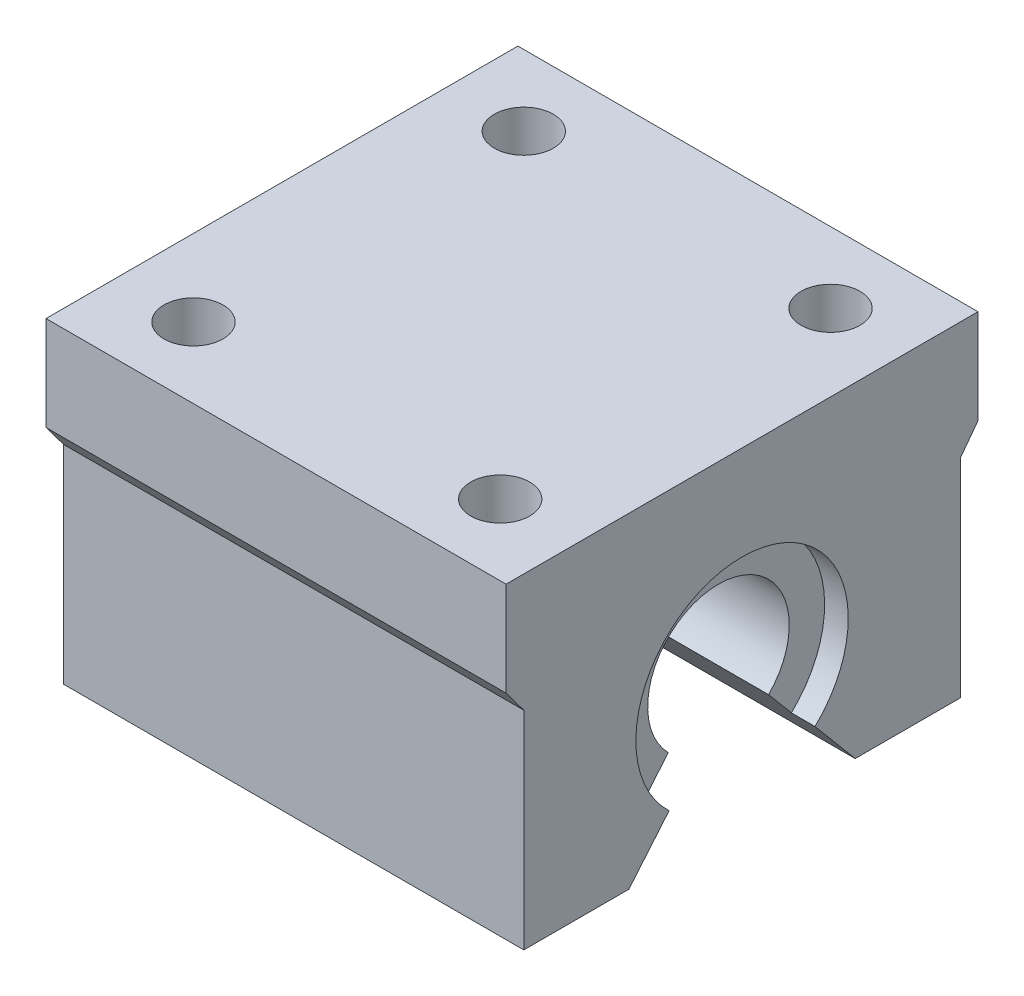
ISO-10303-21;
HEADER;
FILE_DESCRIPTION(('STEP AP214'),'2;1');
FILE_NAME('part.step','',(''),(''),'','','');
FILE_SCHEMA(('AUTOMOTIVE_DESIGN { 1 0 10303 214 1 1 1 1 }'));
ENDSEC;
DATA;
#1=APPLICATION_CONTEXT('core data for automotive mechanical design processes');
#2=APPLICATION_PROTOCOL_DEFINITION('international standard','automotive_design',2000,#1);
#3=PRODUCT_CONTEXT('',#1,'mechanical');
#4=PRODUCT('Part','Part','',(#3));
#5=PRODUCT_RELATED_PRODUCT_CATEGORY('part','',(#4));
#6=PRODUCT_DEFINITION_FORMATION('','',#4);
#7=PRODUCT_DEFINITION_CONTEXT('part definition',#1,'design');
#8=PRODUCT_DEFINITION('design','',#6,#7);
#9=PRODUCT_DEFINITION_SHAPE('','',#8);
#10=(LENGTH_UNIT() NAMED_UNIT(*) SI_UNIT(.MILLI.,.METRE.));
#11=(NAMED_UNIT(*) PLANE_ANGLE_UNIT() SI_UNIT($,.RADIAN.));
#12=(NAMED_UNIT(*) SI_UNIT($,.STERADIAN.) SOLID_ANGLE_UNIT());
#13=UNCERTAINTY_MEASURE_WITH_UNIT(LENGTH_MEASURE(1.E-05),#10,'distance_accuracy_value','');
#14=(GEOMETRIC_REPRESENTATION_CONTEXT(3) GLOBAL_UNCERTAINTY_ASSIGNED_CONTEXT((#13)) GLOBAL_UNIT_ASSIGNED_CONTEXT((#10,
#11,#12)) REPRESENTATION_CONTEXT('',''));
#15=CARTESIAN_POINT('',(0.,0.,0.));
#16=DIRECTION('',(0.,0.,1.));
#17=DIRECTION('',(1.,0.,0.));
#18=AXIS2_PLACEMENT_3D('',#15,#16,#17);
#19=CARTESIAN_POINT('',(39.,10.6,-20.));
#20=DIRECTION('',(-1.,0.,0.));
#21=DIRECTION('',(0.,0.,1.));
#22=AXIS2_PLACEMENT_3D('',#19,#20,#21);
#23=CYLINDRICAL_SURFACE('',#22,6.);
#24=CARTESIAN_POINT('',(37.,10.6,-20.));
#25=DIRECTION('',(1.,0.,0.));
#26=DIRECTION('',(0.,0.,-1.));
#27=AXIS2_PLACEMENT_3D('',#24,#25,#26);
#28=CIRCLE('',#27,6.);
#29=CARTESIAN_POINT('',(37.,6.36473141347565,-15.75));
#30=VERTEX_POINT('',#29);
#31=CARTESIAN_POINT('',(37.,6.36473141347565,-24.25));
#32=VERTEX_POINT('',#31);
#33=EDGE_CURVE('E253',#30,#32,#28,.F.);
#34=ORIENTED_EDGE('',*,*,#33,.F.);
#35=DIRECTION('',(-1.,0.,0.));
#36=VECTOR('',#35,1.);
#37=CARTESIAN_POINT('',(39.,6.36473141347565,-15.75));
#38=LINE('',#37,#36);
#39=CARTESIAN_POINT('',(2.,6.36473141347565,-15.75));
#40=VERTEX_POINT('',#39);
#41=EDGE_CURVE('E208',#30,#40,#38,.T.);
#42=ORIENTED_EDGE('',*,*,#41,.T.);
#43=CARTESIAN_POINT('',(2.,10.6,-20.));
#44=DIRECTION('',(-1.,0.,0.));
#45=DIRECTION('',(0.,0.,1.));
#46=AXIS2_PLACEMENT_3D('',#43,#44,#45);
#47=CIRCLE('',#46,6.);
#48=CARTESIAN_POINT('',(2.,6.36473141347565,-24.25));
#49=VERTEX_POINT('',#48);
#50=EDGE_CURVE('E239',#49,#40,#47,.F.);
#51=ORIENTED_EDGE('',*,*,#50,.F.);
#52=DIRECTION('',(-1.,0.,0.));
#53=VECTOR('',#52,1.);
#54=CARTESIAN_POINT('',(39.,6.36473141347565,-24.25));
#55=LINE('',#54,#53);
#56=EDGE_CURVE('E206',#32,#49,#55,.T.);
#57=ORIENTED_EDGE('',*,*,#56,.F.);
#58=EDGE_LOOP('',(#34,#42,#51,#57));
#59=FACE_BOUND('',#58,.T.);
#60=ADVANCED_FACE('F35',(#59),#23,.F.);
#61=CARTESIAN_POINT('',(39.,6.36473141347565,-15.75));
#62=DIRECTION('',(0.,0.642787609686541,0.766044443118976));
#63=DIRECTION('',(0.,-0.766044443118976,0.642787609686541));
#64=AXIS2_PLACEMENT_3D('',#61,#62,#63);
#65=PLANE('',#64);
#66=DIRECTION('',(1.,0.,0.));
#67=VECTOR('',#66,1.);
#68=CARTESIAN_POINT('',(37.,4.06052054100427,-13.8165375067546));
#69=LINE('',#68,#67);
#70=CARTESIAN_POINT('',(39.,4.06052054100427,-13.8165375067546));
#71=VERTEX_POINT('',#70);
#72=CARTESIAN_POINT('',(37.,4.06052054100427,-13.8165375067546));
#73=VERTEX_POINT('',#72);
#74=EDGE_CURVE('E255',#71,#73,#69,.F.);
#75=ORIENTED_EDGE('',*,*,#74,.F.);
#76=DIRECTION('',(0.,0.766044443118976,-0.642787609686541));
#77=VECTOR('',#76,1.);
#78=CARTESIAN_POINT('',(39.,6.36473141347565,-15.75));
#79=LINE('',#78,#77);
#80=CARTESIAN_POINT('',(39.,0.,-10.4093562184101));
#81=VERTEX_POINT('',#80);
#82=EDGE_CURVE('E223',#81,#71,#79,.T.);
#83=ORIENTED_EDGE('',*,*,#82,.F.);
#84=DIRECTION('',(-1.,0.,0.));
#85=VECTOR('',#84,1.);
#86=CARTESIAN_POINT('',(39.,0.,-10.4093562184101));
#87=LINE('',#86,#85);
#88=CARTESIAN_POINT('',(0.,0.,-10.4093562184101));
#89=VERTEX_POINT('',#88);
#90=EDGE_CURVE('E210',#81,#89,#87,.T.);
#91=ORIENTED_EDGE('',*,*,#90,.T.);
#92=DIRECTION('',(0.,0.766044443118976,-0.642787609686541));
#93=VECTOR('',#92,1.);
#94=CARTESIAN_POINT('',(0.,6.36473141347565,-15.75));
#95=LINE('',#94,#93);
#96=CARTESIAN_POINT('',(0.,4.06052054100427,-13.8165375067546));
#97=VERTEX_POINT('',#96);
#98=EDGE_CURVE('E187',#89,#97,#95,.T.);
#99=ORIENTED_EDGE('',*,*,#98,.T.);
#100=DIRECTION('',(-1.,0.,0.));
#101=VECTOR('',#100,1.);
#102=CARTESIAN_POINT('',(2.,4.06052054100427,-13.8165375067546));
#103=LINE('',#102,#101);
#104=CARTESIAN_POINT('',(2.,4.06052054100427,-13.8165375067546));
#105=VERTEX_POINT('',#104);
#106=EDGE_CURVE('E242',#97,#105,#103,.F.);
#107=ORIENTED_EDGE('',*,*,#106,.T.);
#108=DIRECTION('',(0.,-0.766044443118976,0.642787609686541));
#109=VECTOR('',#108,1.);
#110=CARTESIAN_POINT('',(2.,6.36473141347565,-15.75));
#111=LINE('',#110,#109);
#112=EDGE_CURVE('E185',#40,#105,#111,.T.);
#113=ORIENTED_EDGE('',*,*,#112,.F.);
#114=ORIENTED_EDGE('',*,*,#41,.F.);
#115=DIRECTION('',(0.,0.766044443118976,-0.642787609686541));
#116=VECTOR('',#115,1.);
#117=CARTESIAN_POINT('',(37.,6.36473141347565,-15.75));
#118=LINE('',#117,#116);
#119=EDGE_CURVE('E251',#73,#30,#118,.T.);
#120=ORIENTED_EDGE('',*,*,#119,.F.);
#121=EDGE_LOOP('',(#75,#83,#91,#99,#107,#113,#114,#120));
#122=FACE_BOUND('',#121,.T.);
#123=ADVANCED_FACE('F329',(#122),#65,.F.);
#124=CARTESIAN_POINT('',(39.,6.36473141347565,-24.25));
#125=DIRECTION('',(0.,0.642787609686541,-0.766044443118976));
#126=DIRECTION('',(0.,0.766044443118976,0.642787609686541));
#127=AXIS2_PLACEMENT_3D('',#124,#125,#126);
#128=PLANE('',#127);
#129=DIRECTION('',(1.,0.,0.));
#130=VECTOR('',#129,1.);
#131=CARTESIAN_POINT('',(37.,4.06052054100427,-26.1834624932454));
#132=LINE('',#131,#130);
#133=CARTESIAN_POINT('',(37.,4.06052054100427,-26.1834624932454));
#134=VERTEX_POINT('',#133);
#135=CARTESIAN_POINT('',(39.,4.06052054100427,-26.1834624932454));
#136=VERTEX_POINT('',#135);
#137=EDGE_CURVE('E230',#134,#136,#132,.T.);
#138=ORIENTED_EDGE('',*,*,#137,.F.);
#139=DIRECTION('',(0.,-0.766044443118976,-0.642787609686541));
#140=VECTOR('',#139,1.);
#141=CARTESIAN_POINT('',(37.,6.36473141347565,-24.25));
#142=LINE('',#141,#140);
#143=EDGE_CURVE('E11',#32,#134,#142,.T.);
#144=ORIENTED_EDGE('',*,*,#143,.F.);
#145=ORIENTED_EDGE('',*,*,#56,.T.);
#146=DIRECTION('',(0.,0.766044443118976,0.642787609686541));
#147=VECTOR('',#146,1.);
#148=CARTESIAN_POINT('',(2.,6.36473141347565,-24.25));
#149=LINE('',#148,#147);
#150=CARTESIAN_POINT('',(2.,4.06052054100427,-26.1834624932454));
#151=VERTEX_POINT('',#150);
#152=EDGE_CURVE('E216',#151,#49,#149,.T.);
#153=ORIENTED_EDGE('',*,*,#152,.F.);
#154=DIRECTION('',(-1.,0.,0.));
#155=VECTOR('',#154,1.);
#156=CARTESIAN_POINT('',(2.,4.06052054100427,-26.1834624932454));
#157=LINE('',#156,#155);
#158=CARTESIAN_POINT('',(0.,4.06052054100428,-26.1834624932454));
#159=VERTEX_POINT('',#158);
#160=EDGE_CURVE('E245',#151,#159,#157,.T.);
#161=ORIENTED_EDGE('',*,*,#160,.T.);
#162=DIRECTION('',(0.,-0.766044443118976,-0.642787609686541));
#163=VECTOR('',#162,1.);
#164=CARTESIAN_POINT('',(0.,6.36473141347565,-24.25));
#165=LINE('',#164,#163);
#166=CARTESIAN_POINT('',(0.,0.,-29.5906437815899));
#167=VERTEX_POINT('',#166);
#168=EDGE_CURVE('E190',#159,#167,#165,.T.);
#169=ORIENTED_EDGE('',*,*,#168,.T.);
#170=DIRECTION('',(-1.,0.,0.));
#171=VECTOR('',#170,1.);
#172=CARTESIAN_POINT('',(39.,0.,-29.5906437815899));
#173=LINE('',#172,#171);
#174=CARTESIAN_POINT('',(39.,0.,-29.5906437815899));
#175=VERTEX_POINT('',#174);
#176=EDGE_CURVE('E203',#175,#167,#173,.T.);
#177=ORIENTED_EDGE('',*,*,#176,.F.);
#178=DIRECTION('',(0.,-0.766044443118976,-0.642787609686541));
#179=VECTOR('',#178,1.);
#180=CARTESIAN_POINT('',(39.,6.36473141347565,-24.25));
#181=LINE('',#180,#179);
#182=EDGE_CURVE('E177',#136,#175,#181,.T.);
#183=ORIENTED_EDGE('',*,*,#182,.F.);
#184=EDGE_LOOP('',(#138,#144,#145,#153,#161,#169,#177,#183));
#185=FACE_BOUND('',#184,.T.);
#186=ADVANCED_FACE('F228',(#185),#128,.F.);
#187=CARTESIAN_POINT('',(39.,10.6,-20.));
#188=DIRECTION('',(1.,0.,0.));
#189=DIRECTION('',(0.,0.,-1.));
#190=AXIS2_PLACEMENT_3D('',#187,#188,#189);
#191=PLANE('',#190);
#192=DIRECTION('',(0.,0.8,-0.6));
#193=VECTOR('',#192,1.);
#194=CARTESIAN_POINT('',(39.,17.6,-38.5));
#195=LINE('',#194,#193);
#196=CARTESIAN_POINT('',(39.,17.6,-38.5));
#197=VERTEX_POINT('',#196);
#198=CARTESIAN_POINT('',(39.,19.6,-40.));
#199=VERTEX_POINT('',#198);
#200=EDGE_CURVE('E152',#197,#199,#195,.T.);
#201=ORIENTED_EDGE('',*,*,#200,.T.);
#202=DIRECTION('',(0.,1.,0.));
#203=VECTOR('',#202,1.);
#204=CARTESIAN_POINT('',(39.,0.,-40.));
#205=LINE('',#204,#203);
#206=CARTESIAN_POINT('',(39.,27.6,-40.));
#207=VERTEX_POINT('',#206);
#208=EDGE_CURVE('E163',#199,#207,#205,.T.);
#209=ORIENTED_EDGE('',*,*,#208,.T.);
#210=DIRECTION('',(0.,0.,1.));
#211=VECTOR('',#210,1.);
#212=CARTESIAN_POINT('',(39.,27.6,0.));
#213=LINE('',#212,#211);
#214=CARTESIAN_POINT('',(39.,27.6,0.));
#215=VERTEX_POINT('',#214);
#216=EDGE_CURVE('E172',#207,#215,#213,.T.);
#217=ORIENTED_EDGE('',*,*,#216,.T.);
#218=DIRECTION('',(0.,-1.,0.));
#219=VECTOR('',#218,1.);
#220=CARTESIAN_POINT('',(39.,0.,0.));
#221=LINE('',#220,#219);
#222=CARTESIAN_POINT('',(39.,19.6,0.));
#223=VERTEX_POINT('',#222);
#224=EDGE_CURVE('E199',#215,#223,#221,.T.);
#225=ORIENTED_EDGE('',*,*,#224,.T.);
#226=DIRECTION('',(0.,-0.8,-0.6));
#227=VECTOR('',#226,1.);
#228=CARTESIAN_POINT('',(39.,17.6,-1.5));
#229=LINE('',#228,#227);
#230=CARTESIAN_POINT('',(39.,17.6,-1.5));
#231=VERTEX_POINT('',#230);
#232=EDGE_CURVE('E294',#223,#231,#229,.T.);
#233=ORIENTED_EDGE('',*,*,#232,.T.);
#234=DIRECTION('',(0.,-1.,0.));
#235=VECTOR('',#234,1.);
#236=CARTESIAN_POINT('',(39.,0.,-1.5));
#237=LINE('',#236,#235);
#238=CARTESIAN_POINT('',(39.,0.,-1.5));
#239=VERTEX_POINT('',#238);
#240=EDGE_CURVE('E288',#231,#239,#237,.T.);
#241=ORIENTED_EDGE('',*,*,#240,.T.);
#242=DIRECTION('',(0.,0.,-1.));
#243=VECTOR('',#242,1.);
#244=CARTESIAN_POINT('',(39.,0.,0.));
#245=LINE('',#244,#243);
#246=EDGE_CURVE('E232',#239,#81,#245,.T.);
#247=ORIENTED_EDGE('',*,*,#246,.T.);
#248=ORIENTED_EDGE('',*,*,#82,.T.);
#249=CARTESIAN_POINT('',(39.,10.6,-20.));
#250=DIRECTION('',(1.,0.,0.));
#251=DIRECTION('',(0.,0.,-1.));
#252=AXIS2_PLACEMENT_3D('',#249,#250,#251);
#253=CIRCLE('',#252,9.);
#254=EDGE_CURVE('E43',#71,#136,#253,.F.);
#255=ORIENTED_EDGE('',*,*,#254,.T.);
#256=ORIENTED_EDGE('',*,*,#182,.T.);
#257=DIRECTION('',(0.,0.,-1.));
#258=VECTOR('',#257,1.);
#259=CARTESIAN_POINT('',(39.,0.,-29.5906437815899));
#260=LINE('',#259,#258);
#261=CARTESIAN_POINT('',(39.,0.,-38.5));
#262=VERTEX_POINT('',#261);
#263=EDGE_CURVE('E173',#175,#262,#260,.T.);
#264=ORIENTED_EDGE('',*,*,#263,.T.);
#265=DIRECTION('',(0.,1.,0.));
#266=VECTOR('',#265,1.);
#267=CARTESIAN_POINT('',(39.,0.,-38.5));
#268=LINE('',#267,#266);
#269=EDGE_CURVE('E159',#262,#197,#268,.T.);
#270=ORIENTED_EDGE('',*,*,#269,.T.);
#271=EDGE_LOOP('',(#201,#209,#217,#225,#233,#241,#247,#248,#255,#256,#264,#270));
#272=FACE_BOUND('',#271,.T.);
#273=ADVANCED_FACE('F162',(#272),#191,.T.);
#274=CARTESIAN_POINT('',(39.,0.,0.));
#275=DIRECTION('',(0.,0.,-1.));
#276=DIRECTION('',(-1.,0.,0.));
#277=AXIS2_PLACEMENT_3D('',#274,#275,#276);
#278=PLANE('',#277);
#279=DIRECTION('',(0.,-1.,0.));
#280=VECTOR('',#279,1.);
#281=CARTESIAN_POINT('',(0.,0.,0.));
#282=LINE('',#281,#280);
#283=CARTESIAN_POINT('',(0.,27.6,0.));
#284=VERTEX_POINT('',#283);
#285=CARTESIAN_POINT('',(0.,19.6,0.));
#286=VERTEX_POINT('',#285);
#287=EDGE_CURVE('E181',#284,#286,#282,.T.);
#288=ORIENTED_EDGE('',*,*,#287,.T.);
#289=DIRECTION('',(-1.,0.,0.));
#290=VECTOR('',#289,1.);
#291=CARTESIAN_POINT('',(39.,19.6,0.));
#292=LINE('',#291,#290);
#293=EDGE_CURVE('E58',#223,#286,#292,.T.);
#294=ORIENTED_EDGE('',*,*,#293,.F.);
#295=ORIENTED_EDGE('',*,*,#224,.F.);
#296=DIRECTION('',(-1.,0.,0.));
#297=VECTOR('',#296,1.);
#298=CARTESIAN_POINT('',(39.,27.6,0.));
#299=LINE('',#298,#297);
#300=EDGE_CURVE('E175',#215,#284,#299,.T.);
#301=ORIENTED_EDGE('',*,*,#300,.T.);
#302=EDGE_LOOP('',(#288,#294,#295,#301));
#303=FACE_BOUND('',#302,.T.);
#304=ADVANCED_FACE('F37',(#303),#278,.F.);
#305=CARTESIAN_POINT('',(39.,0.,0.));
#306=DIRECTION('',(0.,1.,0.));
#307=DIRECTION('',(0.,0.,1.));
#308=AXIS2_PLACEMENT_3D('',#305,#306,#307);
#309=PLANE('',#308);
#310=ORIENTED_EDGE('',*,*,#246,.F.);
#311=DIRECTION('',(-1.,0.,0.));
#312=VECTOR('',#311,1.);
#313=CARTESIAN_POINT('',(39.,0.,-1.5));
#314=LINE('',#313,#312);
#315=CARTESIAN_POINT('',(0.,0.,-1.5));
#316=VERTEX_POINT('',#315);
#317=EDGE_CURVE('E283',#239,#316,#314,.T.);
#318=ORIENTED_EDGE('',*,*,#317,.T.);
#319=DIRECTION('',(0.,0.,-1.));
#320=VECTOR('',#319,1.);
#321=CARTESIAN_POINT('',(0.,0.,0.));
#322=LINE('',#321,#320);
#323=EDGE_CURVE('E184',#316,#89,#322,.T.);
#324=ORIENTED_EDGE('',*,*,#323,.T.);
#325=ORIENTED_EDGE('',*,*,#90,.F.);
#326=EDGE_LOOP('',(#310,#318,#324,#325));
#327=FACE_BOUND('',#326,.T.);
#328=ADVANCED_FACE('F326',(#327),#309,.F.);
#329=CARTESIAN_POINT('',(39.,0.,-29.5906437815899));
#330=DIRECTION('',(0.,1.,0.));
#331=DIRECTION('',(0.,0.,1.));
#332=AXIS2_PLACEMENT_3D('',#329,#330,#331);
#333=PLANE('',#332);
#334=DIRECTION('',(0.,0.,-1.));
#335=VECTOR('',#334,1.);
#336=CARTESIAN_POINT('',(0.,0.,-29.5906437815899));
#337=LINE('',#336,#335);
#338=CARTESIAN_POINT('',(0.,0.,-38.5));
#339=VERTEX_POINT('',#338);
#340=EDGE_CURVE('E192',#167,#339,#337,.T.);
#341=ORIENTED_EDGE('',*,*,#340,.T.);
#342=DIRECTION('',(-1.,0.,0.));
#343=VECTOR('',#342,1.);
#344=CARTESIAN_POINT('',(39.,0.,-38.5));
#345=LINE('',#344,#343);
#346=EDGE_CURVE('E50',#262,#339,#345,.T.);
#347=ORIENTED_EDGE('',*,*,#346,.F.);
#348=ORIENTED_EDGE('',*,*,#263,.F.);
#349=ORIENTED_EDGE('',*,*,#176,.T.);
#350=EDGE_LOOP('',(#341,#347,#348,#349));
#351=FACE_BOUND('',#350,.T.);
#352=ADVANCED_FACE('F349',(#351),#333,.F.);
#353=CARTESIAN_POINT('',(39.,0.,-40.));
#354=DIRECTION('',(0.,0.,1.));
#355=DIRECTION('',(1.,0.,0.));
#356=AXIS2_PLACEMENT_3D('',#353,#354,#355);
#357=PLANE('',#356);
#358=ORIENTED_EDGE('',*,*,#208,.F.);
#359=DIRECTION('',(-1.,0.,0.));
#360=VECTOR('',#359,1.);
#361=CARTESIAN_POINT('',(39.,19.6,-40.));
#362=LINE('',#361,#360);
#363=CARTESIAN_POINT('',(0.,19.6,-40.));
#364=VERTEX_POINT('',#363);
#365=EDGE_CURVE('E149',#199,#364,#362,.T.);
#366=ORIENTED_EDGE('',*,*,#365,.T.);
#367=DIRECTION('',(0.,1.,0.));
#368=VECTOR('',#367,1.);
#369=CARTESIAN_POINT('',(0.,0.,-40.));
#370=LINE('',#369,#368);
#371=CARTESIAN_POINT('',(0.,27.6,-40.));
#372=VERTEX_POINT('',#371);
#373=EDGE_CURVE('E195',#364,#372,#370,.T.);
#374=ORIENTED_EDGE('',*,*,#373,.T.);
#375=DIRECTION('',(-1.,0.,0.));
#376=VECTOR('',#375,1.);
#377=CARTESIAN_POINT('',(39.,27.6,-40.));
#378=LINE('',#377,#376);
#379=EDGE_CURVE('E170',#207,#372,#378,.T.);
#380=ORIENTED_EDGE('',*,*,#379,.F.);
#381=EDGE_LOOP('',(#358,#366,#374,#380));
#382=FACE_BOUND('',#381,.T.);
#383=ADVANCED_FACE('F168',(#382),#357,.F.);
#384=CARTESIAN_POINT('',(39.,27.6,0.));
#385=DIRECTION('',(0.,-1.,0.));
#386=DIRECTION('',(0.,0.,-1.));
#387=AXIS2_PLACEMENT_3D('',#384,#385,#386);
#388=PLANE('',#387);
#389=CARTESIAN_POINT('',(32.5,27.6,-34.));
#390=DIRECTION('',(0.,1.,0.));
#391=DIRECTION('',(0.,0.,1.));
#392=AXIS2_PLACEMENT_3D('',#389,#390,#391);
#393=CIRCLE('',#392,2.5);
#394=CARTESIAN_POINT('',(32.5,27.6,-31.5));
#395=VERTEX_POINT('',#394);
#396=EDGE_CURVE('E280',#395,#395,#393,.T.);
#397=ORIENTED_EDGE('',*,*,#396,.F.);
#398=EDGE_LOOP('',(#397));
#399=FACE_BOUND('',#398,.T.);
#400=CARTESIAN_POINT('',(32.5,27.6,-6.));
#401=DIRECTION('',(0.,1.,0.));
#402=DIRECTION('',(0.,0.,-1.));
#403=AXIS2_PLACEMENT_3D('',#400,#401,#402);
#404=CIRCLE('',#403,2.5);
#405=CARTESIAN_POINT('',(32.5,27.6,-8.5));
#406=VERTEX_POINT('',#405);
#407=EDGE_CURVE('E274',#406,#406,#404,.T.);
#408=ORIENTED_EDGE('',*,*,#407,.F.);
#409=EDGE_LOOP('',(#408));
#410=FACE_BOUND('',#409,.T.);
#411=CARTESIAN_POINT('',(6.5,27.6,-34.));
#412=DIRECTION('',(0.,1.,0.));
#413=DIRECTION('',(0.,0.,-1.));
#414=AXIS2_PLACEMENT_3D('',#411,#412,#413);
#415=CIRCLE('',#414,2.5);
#416=CARTESIAN_POINT('',(6.5,27.6,-36.5));
#417=VERTEX_POINT('',#416);
#418=EDGE_CURVE('E268',#417,#417,#415,.T.);
#419=ORIENTED_EDGE('',*,*,#418,.F.);
#420=EDGE_LOOP('',(#419));
#421=FACE_BOUND('',#420,.T.);
#422=CARTESIAN_POINT('',(6.50000000000001,27.6,-6.));
#423=DIRECTION('',(0.,1.,0.));
#424=DIRECTION('',(0.,0.,1.));
#425=AXIS2_PLACEMENT_3D('',#422,#423,#424);
#426=CIRCLE('',#425,2.5);
#427=CARTESIAN_POINT('',(6.50000000000001,27.6,-3.5));
#428=VERTEX_POINT('',#427);
#429=EDGE_CURVE('E262',#428,#428,#426,.T.);
#430=ORIENTED_EDGE('',*,*,#429,.F.);
#431=EDGE_LOOP('',(#430));
#432=FACE_BOUND('',#431,.T.);
#433=DIRECTION('',(0.,0.,1.));
#434=VECTOR('',#433,1.);
#435=CARTESIAN_POINT('',(0.,27.6,0.));
#436=LINE('',#435,#434);
#437=EDGE_CURVE('E197',#372,#284,#436,.T.);
#438=ORIENTED_EDGE('',*,*,#437,.T.);
#439=ORIENTED_EDGE('',*,*,#300,.F.);
#440=ORIENTED_EDGE('',*,*,#216,.F.);
#441=ORIENTED_EDGE('',*,*,#379,.T.);
#442=EDGE_LOOP('',(#438,#439,#440,#441));
#443=FACE_BOUND('',#442,.T.);
#444=ADVANCED_FACE('F313',(#399,#410,#421,#432,#443),#388,.F.);
#445=CARTESIAN_POINT('',(0.,10.6,-20.));
#446=DIRECTION('',(1.,0.,0.));
#447=DIRECTION('',(0.,0.,-1.));
#448=AXIS2_PLACEMENT_3D('',#445,#446,#447);
#449=PLANE('',#448);
#450=ORIENTED_EDGE('',*,*,#373,.F.);
#451=DIRECTION('',(0.,0.8,-0.6));
#452=VECTOR('',#451,1.);
#453=CARTESIAN_POINT('',(0.,17.6,-38.5));
#454=LINE('',#453,#452);
#455=CARTESIAN_POINT('',(0.,17.6,-38.5));
#456=VERTEX_POINT('',#455);
#457=EDGE_CURVE('E155',#456,#364,#454,.T.);
#458=ORIENTED_EDGE('',*,*,#457,.F.);
#459=DIRECTION('',(0.,1.,0.));
#460=VECTOR('',#459,1.);
#461=CARTESIAN_POINT('',(0.,0.,-38.5));
#462=LINE('',#461,#460);
#463=EDGE_CURVE('E166',#339,#456,#462,.T.);
#464=ORIENTED_EDGE('',*,*,#463,.F.);
#465=ORIENTED_EDGE('',*,*,#340,.F.);
#466=ORIENTED_EDGE('',*,*,#168,.F.);
#467=CARTESIAN_POINT('',(0.,10.6,-20.));
#468=DIRECTION('',(1.,0.,0.));
#469=DIRECTION('',(0.,0.,-1.));
#470=AXIS2_PLACEMENT_3D('',#467,#468,#469);
#471=CIRCLE('',#470,9.);
#472=EDGE_CURVE('E213',#159,#97,#471,.T.);
#473=ORIENTED_EDGE('',*,*,#472,.T.);
#474=ORIENTED_EDGE('',*,*,#98,.F.);
#475=ORIENTED_EDGE('',*,*,#323,.F.);
#476=DIRECTION('',(0.,-1.,0.));
#477=VECTOR('',#476,1.);
#478=CARTESIAN_POINT('',(0.,0.,-1.5));
#479=LINE('',#478,#477);
#480=CARTESIAN_POINT('',(0.,17.6,-1.5));
#481=VERTEX_POINT('',#480);
#482=EDGE_CURVE('E292',#481,#316,#479,.T.);
#483=ORIENTED_EDGE('',*,*,#482,.F.);
#484=DIRECTION('',(0.,-0.8,-0.6));
#485=VECTOR('',#484,1.);
#486=CARTESIAN_POINT('',(0.,17.6,-1.5));
#487=LINE('',#486,#485);
#488=EDGE_CURVE('E295',#286,#481,#487,.T.);
#489=ORIENTED_EDGE('',*,*,#488,.F.);
#490=ORIENTED_EDGE('',*,*,#287,.F.);
#491=ORIENTED_EDGE('',*,*,#437,.F.);
#492=EDGE_LOOP('',(#450,#458,#464,#465,#466,#473,#474,#475,#483,#489,#490,#491));
#493=FACE_BOUND('',#492,.T.);
#494=ADVANCED_FACE('F309',(#493),#449,.F.);
#495=CARTESIAN_POINT('',(2.,10.6,-20.));
#496=DIRECTION('',(-1.,0.,0.));
#497=DIRECTION('',(0.,0.,1.));
#498=AXIS2_PLACEMENT_3D('',#495,#496,#497);
#499=PLANE('',#498);
#500=ORIENTED_EDGE('',*,*,#112,.T.);
#501=CARTESIAN_POINT('',(2.,10.6,-20.));
#502=DIRECTION('',(-1.,0.,0.));
#503=DIRECTION('',(0.,0.,1.));
#504=AXIS2_PLACEMENT_3D('',#501,#502,#503);
#505=CIRCLE('',#504,9.);
#506=EDGE_CURVE('E248',#105,#151,#505,.T.);
#507=ORIENTED_EDGE('',*,*,#506,.T.);
#508=ORIENTED_EDGE('',*,*,#152,.T.);
#509=ORIENTED_EDGE('',*,*,#50,.T.);
#510=EDGE_LOOP('',(#500,#507,#508,#509));
#511=FACE_BOUND('',#510,.T.);
#512=ADVANCED_FACE('F343',(#511),#499,.T.);
#513=CARTESIAN_POINT('',(2.,10.6,-20.));
#514=DIRECTION('',(-1.,0.,0.));
#515=DIRECTION('',(0.,0.,1.));
#516=AXIS2_PLACEMENT_3D('',#513,#514,#515);
#517=CYLINDRICAL_SURFACE('',#516,9.);
#518=ORIENTED_EDGE('',*,*,#472,.F.);
#519=ORIENTED_EDGE('',*,*,#160,.F.);
#520=ORIENTED_EDGE('',*,*,#506,.F.);
#521=ORIENTED_EDGE('',*,*,#106,.F.);
#522=EDGE_LOOP('',(#518,#519,#520,#521));
#523=FACE_BOUND('',#522,.T.);
#524=ADVANCED_FACE('F346',(#523),#517,.F.);
#525=CARTESIAN_POINT('',(37.,10.6,-20.));
#526=DIRECTION('',(1.,0.,0.));
#527=DIRECTION('',(0.,0.,1.));
#528=AXIS2_PLACEMENT_3D('',#525,#526,#527);
#529=PLANE('',#528);
#530=ORIENTED_EDGE('',*,*,#119,.T.);
#531=ORIENTED_EDGE('',*,*,#33,.T.);
#532=ORIENTED_EDGE('',*,*,#143,.T.);
#533=CARTESIAN_POINT('',(37.,10.6,-20.));
#534=DIRECTION('',(-1.,0.,0.));
#535=DIRECTION('',(0.,0.,1.));
#536=AXIS2_PLACEMENT_3D('',#533,#534,#535);
#537=CIRCLE('',#536,9.);
#538=EDGE_CURVE('E258',#73,#134,#537,.T.);
#539=ORIENTED_EDGE('',*,*,#538,.F.);
#540=EDGE_LOOP('',(#530,#531,#532,#539));
#541=FACE_BOUND('',#540,.T.);
#542=ADVANCED_FACE('F335',(#541),#529,.T.);
#543=CARTESIAN_POINT('',(37.,10.6,-20.));
#544=DIRECTION('',(1.,0.,0.));
#545=DIRECTION('',(0.,0.,-1.));
#546=AXIS2_PLACEMENT_3D('',#543,#544,#545);
#547=CYLINDRICAL_SURFACE('',#546,9.);
#548=ORIENTED_EDGE('',*,*,#74,.T.);
#549=ORIENTED_EDGE('',*,*,#538,.T.);
#550=ORIENTED_EDGE('',*,*,#137,.T.);
#551=ORIENTED_EDGE('',*,*,#254,.F.);
#552=EDGE_LOOP('',(#548,#549,#550,#551));
#553=FACE_BOUND('',#552,.T.);
#554=ADVANCED_FACE('F333',(#553),#547,.F.);
#555=CARTESIAN_POINT('',(6.50000000000001,17.6,-6.));
#556=DIRECTION('',(0.,1.,0.));
#557=DIRECTION('',(0.,0.,1.));
#558=AXIS2_PLACEMENT_3D('',#555,#556,#557);
#559=CYLINDRICAL_SURFACE('',#558,2.5);
#560=CARTESIAN_POINT('',(6.50000000000001,17.6,-6.));
#561=DIRECTION('',(0.,1.,0.));
#562=DIRECTION('',(0.,0.,1.));
#563=AXIS2_PLACEMENT_3D('',#560,#561,#562);
#564=CIRCLE('',#563,2.5);
#565=CARTESIAN_POINT('',(6.50000000000001,17.6,-3.5));
#566=VERTEX_POINT('',#565);
#567=EDGE_CURVE('E261',#566,#566,#564,.T.);
#568=ORIENTED_EDGE('',*,*,#567,.F.);
#569=EDGE_LOOP('',(#568));
#570=FACE_BOUND('',#569,.T.);
#571=ORIENTED_EDGE('',*,*,#429,.T.);
#572=EDGE_LOOP('',(#571));
#573=FACE_BOUND('',#572,.T.);
#574=ADVANCED_FACE('F389',(#570,#573),#559,.F.);
#575=CARTESIAN_POINT('',(6.50000000000001,17.6,-6.));
#576=DIRECTION('',(0.,1.,0.));
#577=DIRECTION('',(0.,0.,1.));
#578=AXIS2_PLACEMENT_3D('',#575,#576,#577);
#579=PLANE('',#578);
#580=ORIENTED_EDGE('',*,*,#567,.T.);
#581=EDGE_LOOP('',(#580));
#582=FACE_BOUND('',#581,.T.);
#583=ADVANCED_FACE('F391',(#582),#579,.T.);
#584=CARTESIAN_POINT('',(6.5,17.6,-34.));
#585=DIRECTION('',(0.,1.,0.));
#586=DIRECTION('',(0.,0.,1.));
#587=AXIS2_PLACEMENT_3D('',#584,#585,#586);
#588=CYLINDRICAL_SURFACE('',#587,2.5);
#589=CARTESIAN_POINT('',(6.5,17.6,-34.));
#590=DIRECTION('',(0.,1.,0.));
#591=DIRECTION('',(0.,0.,-1.));
#592=AXIS2_PLACEMENT_3D('',#589,#590,#591);
#593=CIRCLE('',#592,2.5);
#594=CARTESIAN_POINT('',(6.5,17.6,-36.5));
#595=VERTEX_POINT('',#594);
#596=EDGE_CURVE('E265',#595,#595,#593,.T.);
#597=ORIENTED_EDGE('',*,*,#596,.F.);
#598=EDGE_LOOP('',(#597));
#599=FACE_BOUND('',#598,.T.);
#600=ORIENTED_EDGE('',*,*,#418,.T.);
#601=EDGE_LOOP('',(#600));
#602=FACE_BOUND('',#601,.T.);
#603=ADVANCED_FACE('F398',(#599,#602),#588,.F.);
#604=CARTESIAN_POINT('',(6.5,17.6,-34.));
#605=DIRECTION('',(0.,-1.,0.));
#606=DIRECTION('',(0.,0.,-1.));
#607=AXIS2_PLACEMENT_3D('',#604,#605,#606);
#608=PLANE('',#607);
#609=ORIENTED_EDGE('',*,*,#596,.T.);
#610=EDGE_LOOP('',(#609));
#611=FACE_BOUND('',#610,.T.);
#612=ADVANCED_FACE('F445',(#611),#608,.F.);
#613=CARTESIAN_POINT('',(32.5,17.6,-6.));
#614=DIRECTION('',(0.,1.,0.));
#615=DIRECTION('',(0.,0.,1.));
#616=AXIS2_PLACEMENT_3D('',#613,#614,#615);
#617=CYLINDRICAL_SURFACE('',#616,2.5);
#618=CARTESIAN_POINT('',(32.5,17.6,-6.));
#619=DIRECTION('',(0.,1.,0.));
#620=DIRECTION('',(0.,0.,-1.));
#621=AXIS2_PLACEMENT_3D('',#618,#619,#620);
#622=CIRCLE('',#621,2.5);
#623=CARTESIAN_POINT('',(32.5,17.6,-8.5));
#624=VERTEX_POINT('',#623);
#625=EDGE_CURVE('E271',#624,#624,#622,.T.);
#626=ORIENTED_EDGE('',*,*,#625,.F.);
#627=EDGE_LOOP('',(#626));
#628=FACE_BOUND('',#627,.T.);
#629=ORIENTED_EDGE('',*,*,#407,.T.);
#630=EDGE_LOOP('',(#629));
#631=FACE_BOUND('',#630,.T.);
#632=ADVANCED_FACE('F454',(#628,#631),#617,.F.);
#633=CARTESIAN_POINT('',(32.5,17.6,-6.));
#634=DIRECTION('',(0.,-1.,0.));
#635=DIRECTION('',(0.,0.,-1.));
#636=AXIS2_PLACEMENT_3D('',#633,#634,#635);
#637=PLANE('',#636);
#638=ORIENTED_EDGE('',*,*,#625,.T.);
#639=EDGE_LOOP('',(#638));
#640=FACE_BOUND('',#639,.T.);
#641=ADVANCED_FACE('F464',(#640),#637,.F.);
#642=CARTESIAN_POINT('',(32.5,17.6,-34.));
#643=DIRECTION('',(0.,1.,0.));
#644=DIRECTION('',(0.,0.,1.));
#645=AXIS2_PLACEMENT_3D('',#642,#643,#644);
#646=CYLINDRICAL_SURFACE('',#645,2.5);
#647=CARTESIAN_POINT('',(32.5,17.6,-34.));
#648=DIRECTION('',(0.,1.,0.));
#649=DIRECTION('',(0.,0.,1.));
#650=AXIS2_PLACEMENT_3D('',#647,#648,#649);
#651=CIRCLE('',#650,2.5);
#652=CARTESIAN_POINT('',(32.5,17.6,-31.5));
#653=VERTEX_POINT('',#652);
#654=EDGE_CURVE('E277',#653,#653,#651,.T.);
#655=ORIENTED_EDGE('',*,*,#654,.F.);
#656=EDGE_LOOP('',(#655));
#657=FACE_BOUND('',#656,.T.);
#658=ORIENTED_EDGE('',*,*,#396,.T.);
#659=EDGE_LOOP('',(#658));
#660=FACE_BOUND('',#659,.T.);
#661=ADVANCED_FACE('F474',(#657,#660),#646,.F.);
#662=CARTESIAN_POINT('',(32.5,17.6,-34.));
#663=DIRECTION('',(0.,1.,0.));
#664=DIRECTION('',(0.,0.,1.));
#665=AXIS2_PLACEMENT_3D('',#662,#663,#664);
#666=PLANE('',#665);
#667=ORIENTED_EDGE('',*,*,#654,.T.);
#668=EDGE_LOOP('',(#667));
#669=FACE_BOUND('',#668,.T.);
#670=ADVANCED_FACE('F484',(#669),#666,.T.);
#671=CARTESIAN_POINT('',(39.,0.,-1.5));
#672=DIRECTION('',(0.,0.,-1.));
#673=DIRECTION('',(-1.,0.,0.));
#674=AXIS2_PLACEMENT_3D('',#671,#672,#673);
#675=PLANE('',#674);
#676=ORIENTED_EDGE('',*,*,#482,.T.);
#677=ORIENTED_EDGE('',*,*,#317,.F.);
#678=ORIENTED_EDGE('',*,*,#240,.F.);
#679=DIRECTION('',(-1.,0.,0.));
#680=VECTOR('',#679,1.);
#681=CARTESIAN_POINT('',(39.,17.6,-1.5));
#682=LINE('',#681,#680);
#683=EDGE_CURVE('E287',#231,#481,#682,.T.);
#684=ORIENTED_EDGE('',*,*,#683,.T.);
#685=EDGE_LOOP('',(#676,#677,#678,#684));
#686=FACE_BOUND('',#685,.T.);
#687=ADVANCED_FACE('F322',(#686),#675,.F.);
#688=CARTESIAN_POINT('',(39.,17.6,-1.5));
#689=DIRECTION('',(0.,0.6,-0.8));
#690=DIRECTION('',(0.,0.8,0.6));
#691=AXIS2_PLACEMENT_3D('',#688,#689,#690);
#692=PLANE('',#691);
#693=ORIENTED_EDGE('',*,*,#488,.T.);
#694=ORIENTED_EDGE('',*,*,#683,.F.);
#695=ORIENTED_EDGE('',*,*,#232,.F.);
#696=ORIENTED_EDGE('',*,*,#293,.T.);
#697=EDGE_LOOP('',(#693,#694,#695,#696));
#698=FACE_BOUND('',#697,.T.);
#699=ADVANCED_FACE('F319',(#698),#692,.F.);
#700=CARTESIAN_POINT('',(39.,17.6,-38.5));
#701=DIRECTION('',(0.,0.6,0.8));
#702=DIRECTION('',(0.,-0.8,0.6));
#703=AXIS2_PLACEMENT_3D('',#700,#701,#702);
#704=PLANE('',#703);
#705=ORIENTED_EDGE('',*,*,#457,.T.);
#706=ORIENTED_EDGE('',*,*,#365,.F.);
#707=ORIENTED_EDGE('',*,*,#200,.F.);
#708=DIRECTION('',(-1.,0.,0.));
#709=VECTOR('',#708,1.);
#710=CARTESIAN_POINT('',(39.,17.6,-38.5));
#711=LINE('',#710,#709);
#712=EDGE_CURVE('E297',#197,#456,#711,.T.);
#713=ORIENTED_EDGE('',*,*,#712,.T.);
#714=EDGE_LOOP('',(#705,#706,#707,#713));
#715=FACE_BOUND('',#714,.T.);
#716=ADVANCED_FACE('F151',(#715),#704,.F.);
#717=CARTESIAN_POINT('',(39.,0.,-38.5));
#718=DIRECTION('',(0.,0.,1.));
#719=DIRECTION('',(0.,-1.,0.));
#720=AXIS2_PLACEMENT_3D('',#717,#718,#719);
#721=PLANE('',#720);
#722=ORIENTED_EDGE('',*,*,#463,.T.);
#723=ORIENTED_EDGE('',*,*,#712,.F.);
#724=ORIENTED_EDGE('',*,*,#269,.F.);
#725=ORIENTED_EDGE('',*,*,#346,.T.);
#726=EDGE_LOOP('',(#722,#723,#724,#725));
#727=FACE_BOUND('',#726,.T.);
#728=ADVANCED_FACE('F306',(#727),#721,.F.);
#729=CLOSED_SHELL('',(#60,#123,#186,#273,#304,#328,#352,#383,#444,#494,#512,#524,#542,#554,#574,
#583,#603,#612,#632,#641,#661,#670,#687,#699,#716,#728));
#730=MANIFOLD_SOLID_BREP('B2',#729);
#731=ADVANCED_BREP_SHAPE_REPRESENTATION('',(#18,#730),#14);
#732=SHAPE_DEFINITION_REPRESENTATION(#9,#731);
ENDSEC;
END-ISO-10303-21;
